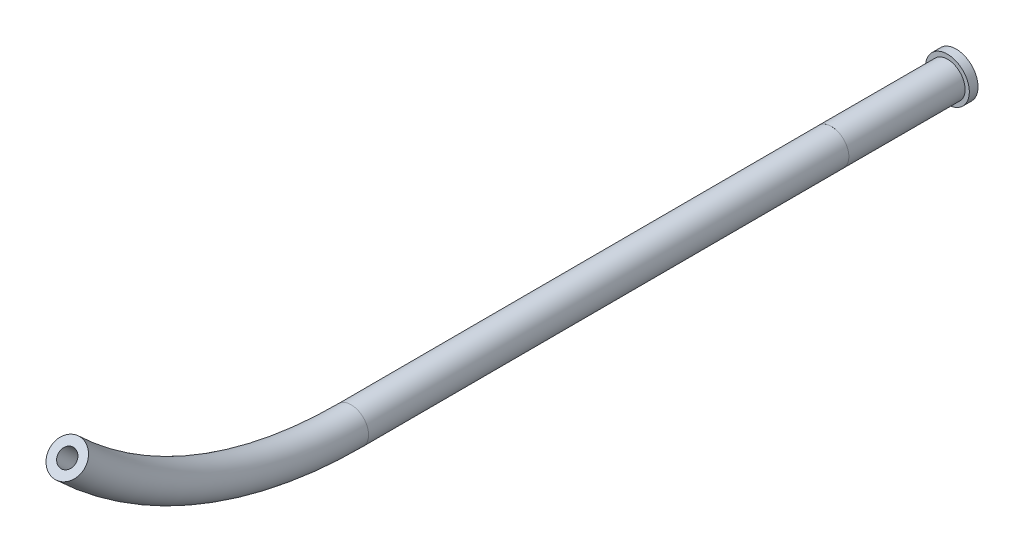
ISO-10303-21;
HEADER;
FILE_DESCRIPTION(('STEP AP214'),'2;1');
FILE_NAME('part.step','',(''),(''),'','','');
FILE_SCHEMA(('AUTOMOTIVE_DESIGN { 1 0 10303 214 1 1 1 1 }'));
ENDSEC;
DATA;
#1=APPLICATION_CONTEXT('core data for automotive mechanical design processes');
#2=APPLICATION_PROTOCOL_DEFINITION('international standard','automotive_design',2000,#1);
#3=PRODUCT_CONTEXT('',#1,'mechanical');
#4=PRODUCT('Part','Part','',(#3));
#5=PRODUCT_RELATED_PRODUCT_CATEGORY('part','',(#4));
#6=PRODUCT_DEFINITION_FORMATION('','',#4);
#7=PRODUCT_DEFINITION_CONTEXT('part definition',#1,'design');
#8=PRODUCT_DEFINITION('design','',#6,#7);
#9=PRODUCT_DEFINITION_SHAPE('','',#8);
#10=(LENGTH_UNIT() NAMED_UNIT(*) SI_UNIT(.MILLI.,.METRE.));
#11=(NAMED_UNIT(*) PLANE_ANGLE_UNIT() SI_UNIT($,.RADIAN.));
#12=(NAMED_UNIT(*) SI_UNIT($,.STERADIAN.) SOLID_ANGLE_UNIT());
#13=UNCERTAINTY_MEASURE_WITH_UNIT(LENGTH_MEASURE(1.E-05),#10,'distance_accuracy_value','');
#14=(GEOMETRIC_REPRESENTATION_CONTEXT(3) GLOBAL_UNCERTAINTY_ASSIGNED_CONTEXT((#13)) GLOBAL_UNIT_ASSIGNED_CONTEXT((#10,
#11,#12)) REPRESENTATION_CONTEXT('',''));
#15=CARTESIAN_POINT('',(0.,0.,0.));
#16=DIRECTION('',(0.,0.,1.));
#17=DIRECTION('',(1.,0.,0.));
#18=AXIS2_PLACEMENT_3D('',#15,#16,#17);
#19=CARTESIAN_POINT('',(6.35201812929944E-06,-15.0662967325856,0.00356426653191216));
#20=DIRECTION('',(-0.00178213609600422,0.,-0.999998411994207));
#21=DIRECTION('',(0.00122916378735073,0.999999244575507,-2.19054063343993E-06));
#22=AXIS2_PLACEMENT_3D('',#19,#20,#21);
#23=PLANE('',#22);
#24=CARTESIAN_POINT('',(6.35201812929944E-06,-15.0662967325856,0.00356426653191216));
#25=DIRECTION('',(-0.00178213609600422,0.,-0.999998411994207));
#26=DIRECTION('',(-0.999998411994207,0.,0.00178213609600422));
#27=AXIS2_PLACEMENT_3D('',#24,#25,#26);
#28=CIRCLE('',#27,1.);
#29=CARTESIAN_POINT('',(-0.999992059976078,-15.0662967325856,0.00534640262791638));
#30=VERTEX_POINT('',#29);
#31=EDGE_CURVE('E75',#30,#30,#28,.T.);
#32=ORIENTED_EDGE('',*,*,#31,.F.);
#33=EDGE_LOOP('',(#32));
#34=FACE_BOUND('',#33,.T.);
#35=CARTESIAN_POINT('',(6.35201812929944E-06,-15.0662967325856,0.00356426653191216));
#36=DIRECTION('',(-0.00178213609600422,0.,-0.999998411994207));
#37=DIRECTION('',(0.00122916378735073,0.999999244575507,-2.19054063343993E-06));
#38=AXIS2_PLACEMENT_3D('',#35,#36,#37);
#39=CIRCLE('',#38,2.);
#40=CARTESIAN_POINT('',(0.00246467959283075,-13.0662982434345,0.00355988545064528));
#41=VERTEX_POINT('',#40);
#42=EDGE_CURVE('E65',#41,#41,#39,.T.);
#43=ORIENTED_EDGE('',*,*,#42,.T.);
#44=EDGE_LOOP('',(#43));
#45=FACE_BOUND('',#44,.T.);
#46=ADVANCED_FACE('F55',(#34,#45),#23,.T.);
#47=CARTESIAN_POINT('',(0.155936405643266,-2.06629673258552,87.4995789406769));
#48=DIRECTION('',(-0.00129041201400469,-0.68971428088338,-0.724080482807234));
#49=DIRECTION('',(0.,0.724081085664061,-0.689714855127504));
#50=AXIS2_PLACEMENT_3D('',#47,#48,#49);
#51=PLANE('',#50);
#52=CARTESIAN_POINT('',(0.155936405643266,-2.06629673258552,87.4995789406769));
#53=DIRECTION('',(-0.00129041201400469,-0.68971428088338,-0.724080482807234));
#54=DIRECTION('',(0.,0.724081085664061,-0.689714855127504));
#55=AXIS2_PLACEMENT_3D('',#52,#53,#54);
#56=CIRCLE('',#55,1.);
#57=CARTESIAN_POINT('',(0.157165570359158,-2.79037836523858,88.1892921262901));
#58=VERTEX_POINT('',#57);
#59=EDGE_CURVE('E69',#58,#58,#56,.T.);
#60=ORIENTED_EDGE('',*,*,#59,.T.);
#61=EDGE_LOOP('',(#60));
#62=FACE_BOUND('',#61,.T.);
#63=CARTESIAN_POINT('',(0.155936405643266,-2.06629673258552,87.4995789406769));
#64=DIRECTION('',(-0.00129041201400469,-0.68971428088338,-0.724080482807234));
#65=DIRECTION('',(0.,0.724081085664061,-0.689714855127504));
#66=AXIS2_PLACEMENT_3D('',#63,#64,#65);
#67=CIRCLE('',#66,2.);
#68=CARTESIAN_POINT('',(0.15839473507505,-3.51445999789166,88.8790053119032));
#69=VERTEX_POINT('',#68);
#70=EDGE_CURVE('E12',#69,#69,#67,.T.);
#71=ORIENTED_EDGE('',*,*,#70,.F.);
#72=EDGE_LOOP('',(#71));
#73=FACE_BOUND('',#72,.T.);
#74=ADVANCED_FACE('F92',(#62,#73),#51,.F.);
#75=CARTESIAN_POINT('',(6.35201812929944E-06,-15.0662967325856,0.00356426653191216));
#76=DIRECTION('',(0.00178213609600421,0.,0.999998411994207));
#77=DIRECTION('',(0.999998411994207,0.,-0.00178213609600421));
#78=AXIS2_PLACEMENT_3D('',#75,#76,#77);
#79=CYLINDRICAL_SURFACE('',#78,2.);
#80=CARTESIAN_POINT('',(0.0980238372983611,-15.0662967325855,55.0034769262133));
#81=DIRECTION('',(-0.00178213609600422,0.,-0.999998411994207));
#82=DIRECTION('',(0.00122916378735073,0.999999244575507,-2.19054063343993E-06));
#83=AXIS2_PLACEMENT_3D('',#80,#81,#82);
#84=CIRCLE('',#83,2.);
#85=CARTESIAN_POINT('',(0.0980238372983611,-17.0662967325855,55.0034769262133));
#86=VERTEX_POINT('',#85);
#87=EDGE_CURVE('E61',#86,#86,#84,.T.);
#88=ORIENTED_EDGE('',*,*,#87,.T.);
#89=EDGE_LOOP('',(#88));
#90=FACE_BOUND('',#89,.T.);
#91=ORIENTED_EDGE('',*,*,#42,.F.);
#92=EDGE_LOOP('',(#91));
#93=FACE_BOUND('',#92,.T.);
#94=ADVANCED_FACE('F95',(#90,#93),#79,.T.);
#95=CARTESIAN_POINT('',(0.0980238372983611,32.0490878827991,55.0034769262133));
#96=DIRECTION('',(-0.999998411994207,0.,0.00178213609600421));
#97=DIRECTION('',(0.00178213609600421,0.,0.999998411994207));
#98=AXIS2_PLACEMENT_3D('',#95,#96,#97);
#99=TOROIDAL_SURFACE('',#98,47.1153846153846,2.);
#100=CARTESIAN_POINT('',(0.0980238372983611,32.0490878827991,55.0034769262133));
#101=DIRECTION('',(-0.999998411994207,0.,0.00178213609600421));
#102=DIRECTION('',(0.00178213609600421,0.,0.999998411994207));
#103=AXIS2_PLACEMENT_3D('',#100,#101,#102);
#104=CIRCLE('',#103,49.1153846153846);
#105=EDGE_CURVE('',#86,#69,#104,.T.);
#106=ORIENTED_EDGE('',*,*,#87,.F.);
#107=ORIENTED_EDGE('',*,*,#70,.T.);
#108=ORIENTED_EDGE('',*,*,#105,.T.);
#109=ORIENTED_EDGE('',*,*,#105,.F.);
#110=EDGE_LOOP('',(#106,#108,#107,#109));
#111=FACE_BOUND('',#110,.T.);
#112=ADVANCED_FACE('F86',(#111),#99,.T.);
#113=CARTESIAN_POINT('',(6.35201812929944E-06,-15.0662967325856,0.00356426653191216));
#114=DIRECTION('',(0.00178213609600421,0.,0.999998411994207));
#115=DIRECTION('',(0.999998411994207,0.,-0.00178213609600421));
#116=AXIS2_PLACEMENT_3D('',#113,#114,#115);
#117=CYLINDRICAL_SURFACE('',#116,1.);
#118=CARTESIAN_POINT('',(0.0980238372983611,-15.0662967325855,55.0034769262133));
#119=DIRECTION('',(0.00178213609600421,0.,0.999998411994207));
#120=DIRECTION('',(0.999998411994207,0.,-0.00178213609600421));
#121=AXIS2_PLACEMENT_3D('',#118,#119,#120);
#122=CIRCLE('',#121,1.);
#123=CARTESIAN_POINT('',(0.0980238372983611,-16.0662967325855,55.0034769262133));
#124=VERTEX_POINT('',#123);
#125=EDGE_CURVE('E74',#124,#124,#122,.F.);
#126=ORIENTED_EDGE('',*,*,#125,.F.);
#127=EDGE_LOOP('',(#126));
#128=FACE_BOUND('',#127,.T.);
#129=ORIENTED_EDGE('',*,*,#31,.T.);
#130=EDGE_LOOP('',(#129));
#131=FACE_BOUND('',#130,.T.);
#132=ADVANCED_FACE('F83',(#128,#131),#117,.F.);
#133=CARTESIAN_POINT('',(0.0980238372983611,32.0490878827991,55.0034769262133));
#134=DIRECTION('',(-0.999998411994207,0.,0.00178213609600421));
#135=DIRECTION('',(0.00178213609600421,0.,0.999998411994207));
#136=AXIS2_PLACEMENT_3D('',#133,#134,#135);
#137=TOROIDAL_SURFACE('',#136,47.1153846153846,1.);
#138=CARTESIAN_POINT('',(0.0980238372983611,32.0490878827991,55.0034769262133));
#139=DIRECTION('',(-0.999998411994207,0.,0.00178213609600421));
#140=DIRECTION('',(0.00178213609600421,0.,0.999998411994207));
#141=AXIS2_PLACEMENT_3D('',#138,#139,#140);
#142=CIRCLE('',#141,48.1153846153846);
#143=EDGE_CURVE('',#124,#58,#142,.T.);
#144=ORIENTED_EDGE('',*,*,#125,.T.);
#145=ORIENTED_EDGE('',*,*,#59,.F.);
#146=ORIENTED_EDGE('',*,*,#143,.T.);
#147=ORIENTED_EDGE('',*,*,#143,.F.);
#148=EDGE_LOOP('',(#144,#146,#145,#147));
#149=FACE_BOUND('',#148,.T.);
#150=ADVANCED_FACE('F81',(#149),#137,.F.);
#151=CLOSED_SHELL('',(#46,#74,#94,#112,#132,#150));
#152=MANIFOLD_SOLID_BREP('B2',#151);
#153=CARTESIAN_POINT('',(-2.97629111990829,-13.3,-13.2824313876356));
#154=DIRECTION('',(0.00178213609600439,0.,0.999998411994207));
#155=DIRECTION('',(0.,1.,0.));
#156=AXIS2_PLACEMENT_3D('',#153,#154,#155);
#157=PLANE('',#156);
#158=CARTESIAN_POINT('',(0.,-15.0662967325855,-13.2877355518956));
#159=DIRECTION('',(0.00178213609600439,0.,0.999998411994207));
#160=DIRECTION('',(-0.999998411994207,-1.55743052406844E-13,0.00178213609600439));
#161=AXIS2_PLACEMENT_3D('',#158,#159,#160);
#162=ELLIPSE('',#161,1.00000158800832,1.);
#163=CARTESIAN_POINT('',(-0.0118542063082323,-16.0662264690131,-13.2877144260531));
#164=VERTEX_POINT('',#163);
#165=CARTESIAN_POINT('',(-0.0118542063085234,-14.0663669961577,-13.2877144260531));
#166=VERTEX_POINT('',#165);
#167=EDGE_CURVE('E172',#164,#166,#162,.F.);
#168=ORIENTED_EDGE('',*,*,#167,.F.);
#169=CARTESIAN_POINT('',(-0.0236805155563385,-15.0662967325855,-13.2876933499271));
#170=DIRECTION('',(-0.00178213609600439,0.,-0.999998411994207));
#171=DIRECTION('',(-0.999998411994207,0.,0.00178213609600439));
#172=AXIS2_PLACEMENT_3D('',#169,#170,#171);
#173=CIRCLE('',#172,0.999999669913337);
#174=EDGE_CURVE('E53',#164,#166,#173,.T.);
#175=ORIENTED_EDGE('',*,*,#174,.T.);
#176=EDGE_LOOP('',(#168,#175));
#177=FACE_BOUND('',#176,.T.);
#178=ADVANCED_FACE('F147',(#177),#157,.F.);
#179=CARTESIAN_POINT('',(0.,-15.0662967325855,-18.9445942929538));
#180=DIRECTION('',(0.,0.,1.));
#181=DIRECTION('',(1.,0.,0.));
#182=AXIS2_PLACEMENT_3D('',#179,#180,#181);
#183=CYLINDRICAL_SURFACE('',#182,2.);
#184=CARTESIAN_POINT('',(0.,-15.0662967325855,-13.2877355518956));
#185=DIRECTION('',(0.00178213609600439,0.,0.999998411994207));
#186=DIRECTION('',(-0.999998411994207,-1.55743052406844E-13,0.00178213609600439));
#187=AXIS2_PLACEMENT_3D('',#184,#185,#186);
#188=ELLIPSE('',#187,2.00000317601663,2.);
#189=CARTESIAN_POINT('',(-2.,-15.0662967325858,-13.2841712740435));
#190=VERTEX_POINT('',#189);
#191=EDGE_CURVE('E174',#190,#190,#188,.F.);
#192=ORIENTED_EDGE('',*,*,#191,.F.);
#193=EDGE_LOOP('',(#192));
#194=FACE_BOUND('',#193,.T.);
#195=CARTESIAN_POINT('',(0.,-15.0662967325855,0.));
#196=DIRECTION('',(0.,0.,1.));
#197=DIRECTION('',(1.,0.,0.));
#198=AXIS2_PLACEMENT_3D('',#195,#196,#197);
#199=CIRCLE('',#198,2.);
#200=CARTESIAN_POINT('',(2.,-15.0662967325855,0.));
#201=VERTEX_POINT('',#200);
#202=EDGE_CURVE('E185',#201,#201,#199,.T.);
#203=ORIENTED_EDGE('',*,*,#202,.F.);
#204=EDGE_LOOP('',(#203));
#205=FACE_BOUND('',#204,.T.);
#206=ADVANCED_FACE('F149',(#194,#205),#183,.T.);
#207=CARTESIAN_POINT('',(0.,-15.0662967325855,0.));
#208=DIRECTION('',(0.,0.,1.));
#209=DIRECTION('',(1.,0.,0.));
#210=AXIS2_PLACEMENT_3D('',#207,#208,#209);
#211=PLANE('',#210);
#212=CARTESIAN_POINT('',(0.,-15.0662967325855,0.));
#213=DIRECTION('',(0.,0.,1.));
#214=DIRECTION('',(1.,0.,0.));
#215=AXIS2_PLACEMENT_3D('',#212,#213,#214);
#216=CIRCLE('',#215,1.);
#217=CARTESIAN_POINT('',(1.,-15.0662967325855,0.));
#218=VERTEX_POINT('',#217);
#219=EDGE_CURVE('E183',#218,#218,#216,.T.);
#220=ORIENTED_EDGE('',*,*,#219,.F.);
#221=EDGE_LOOP('',(#220));
#222=FACE_BOUND('',#221,.T.);
#223=ORIENTED_EDGE('',*,*,#202,.T.);
#224=EDGE_LOOP('',(#223));
#225=FACE_BOUND('',#224,.T.);
#226=ADVANCED_FACE('F179',(#222,#225),#211,.T.);
#227=CARTESIAN_POINT('',(0.,-15.0662967325855,-18.9445942929538));
#228=DIRECTION('',(0.,0.,1.));
#229=DIRECTION('',(1.,0.,0.));
#230=AXIS2_PLACEMENT_3D('',#227,#228,#229);
#231=CYLINDRICAL_SURFACE('',#230,1.);
#232=EDGE_CURVE('E151',#166,#164,#162,.F.);
#233=ORIENTED_EDGE('',*,*,#232,.T.);
#234=ORIENTED_EDGE('',*,*,#167,.T.);
#235=EDGE_LOOP('',(#233,#234));
#236=FACE_BOUND('',#235,.T.);
#237=ORIENTED_EDGE('',*,*,#219,.T.);
#238=EDGE_LOOP('',(#237));
#239=FACE_BOUND('',#238,.T.);
#240=ADVANCED_FACE('F175',(#236,#239),#231,.F.);
#241=CARTESIAN_POINT('',(-0.0236805155563385,-15.0662967325855,-13.2876933499271));
#242=DIRECTION('',(-0.00178213609600439,0.,-0.999998411994207));
#243=DIRECTION('',(-0.999998411994207,0.,0.00178213609600439));
#244=AXIS2_PLACEMENT_3D('',#241,#242,#243);
#245=PLANE('',#244);
#246=CARTESIAN_POINT('',(-0.0236805155563385,-15.0662967325855,-13.2876933499271));
#247=DIRECTION('',(-0.00178213609600439,0.,-0.999998411994207));
#248=DIRECTION('',(-0.999998411994207,0.,0.00178213609600439));
#249=AXIS2_PLACEMENT_3D('',#246,#247,#248);
#250=CIRCLE('',#249,2.5);
#251=CARTESIAN_POINT('',(-2.52367654554186,-15.0662967325855,-13.2832380096871));
#252=VERTEX_POINT('',#251);
#253=EDGE_CURVE('E190',#252,#252,#250,.T.);
#254=ORIENTED_EDGE('',*,*,#253,.F.);
#255=EDGE_LOOP('',(#254));
#256=FACE_BOUND('',#255,.T.);
#257=ORIENTED_EDGE('',*,*,#191,.T.);
#258=EDGE_LOOP('',(#257));
#259=FACE_BOUND('',#258,.T.);
#260=ADVANCED_FACE('F178',(#256,#259),#245,.F.);
#261=CARTESIAN_POINT('',(-0.0254626516523429,-15.0662967325855,-14.2876917619213));
#262=DIRECTION('',(-0.00178213609600439,0.,-0.999998411994207));
#263=DIRECTION('',(-0.999998411994207,0.,0.00178213609600439));
#264=AXIS2_PLACEMENT_3D('',#261,#262,#263);
#265=PLANE('',#264);
#266=CARTESIAN_POINT('',(-0.0254626516523429,-15.0662967325855,-14.2876917619213));
#267=DIRECTION('',(-0.00178213609600439,0.,-0.999998411994207));
#268=DIRECTION('',(-0.999998411994207,0.,0.00178213609600439));
#269=AXIS2_PLACEMENT_3D('',#266,#267,#268);
#270=CIRCLE('',#269,2.5);
#271=CARTESIAN_POINT('',(-2.52545868163786,-15.0662967325855,-14.2832364216813));
#272=VERTEX_POINT('',#271);
#273=EDGE_CURVE('E186',#272,#272,#270,.T.);
#274=ORIENTED_EDGE('',*,*,#273,.T.);
#275=EDGE_LOOP('',(#274));
#276=FACE_BOUND('',#275,.T.);
#277=CARTESIAN_POINT('',(-0.0254626516523429,-15.0662967325855,-14.2876917619213));
#278=DIRECTION('',(-0.00178213609600439,0.,-0.999998411994207));
#279=DIRECTION('',(-0.999998411994207,0.,0.00178213609600439));
#280=AXIS2_PLACEMENT_3D('',#277,#278,#279);
#281=CIRCLE('',#280,0.999999669913337);
#282=CARTESIAN_POINT('',(-1.02546073356041,-15.0662967325855,-14.2859096264135));
#283=VERTEX_POINT('',#282);
#284=EDGE_CURVE('E171',#283,#283,#281,.T.);
#285=ORIENTED_EDGE('',*,*,#284,.F.);
#286=EDGE_LOOP('',(#285));
#287=FACE_BOUND('',#286,.T.);
#288=ADVANCED_FACE('F201',(#276,#287),#265,.T.);
#289=ORIENTED_EDGE('',*,*,#232,.F.);
#290=EDGE_CURVE('E157',#166,#164,#173,.T.);
#291=ORIENTED_EDGE('',*,*,#290,.T.);
#292=EDGE_LOOP('',(#289,#291));
#293=FACE_BOUND('',#292,.T.);
#294=ADVANCED_FACE('F169',(#293),#245,.F.);
#295=CARTESIAN_POINT('',(-0.0254626516523429,-15.0662967325855,-14.2876917619213));
#296=DIRECTION('',(0.00178213609600439,0.,0.999998411994207));
#297=DIRECTION('',(0.999998411994207,0.,-0.00178213609600439));
#298=AXIS2_PLACEMENT_3D('',#295,#296,#297);
#299=CYLINDRICAL_SURFACE('',#298,2.5);
#300=ORIENTED_EDGE('',*,*,#273,.F.);
#301=EDGE_LOOP('',(#300));
#302=FACE_BOUND('',#301,.T.);
#303=ORIENTED_EDGE('',*,*,#253,.T.);
#304=EDGE_LOOP('',(#303));
#305=FACE_BOUND('',#304,.T.);
#306=ADVANCED_FACE('F209',(#302,#305),#299,.T.);
#307=CARTESIAN_POINT('',(-0.0254626516523429,-15.0662967325855,-14.2876917619213));
#308=DIRECTION('',(0.00178213609600439,0.,0.999998411994207));
#309=DIRECTION('',(0.999998411994207,0.,-0.00178213609600439));
#310=AXIS2_PLACEMENT_3D('',#307,#308,#309);
#311=CYLINDRICAL_SURFACE('',#310,0.999999669913337);
#312=ORIENTED_EDGE('',*,*,#284,.T.);
#313=EDGE_LOOP('',(#312));
#314=FACE_BOUND('',#313,.T.);
#315=ORIENTED_EDGE('',*,*,#290,.F.);
#316=ORIENTED_EDGE('',*,*,#174,.F.);
#317=EDGE_LOOP('',(#315,#316));
#318=FACE_BOUND('',#317,.T.);
#319=ADVANCED_FACE('F164',(#314,#318),#311,.F.);
#320=CLOSED_SHELL('',(#178,#206,#226,#240,#260,#288,#294,#306,#319));
#321=MANIFOLD_SOLID_BREP('B7',#320);
#322=ADVANCED_BREP_SHAPE_REPRESENTATION('',(#18,#152,#321),#14);
#323=SHAPE_DEFINITION_REPRESENTATION(#9,#322);
ENDSEC;
END-ISO-10303-21;
